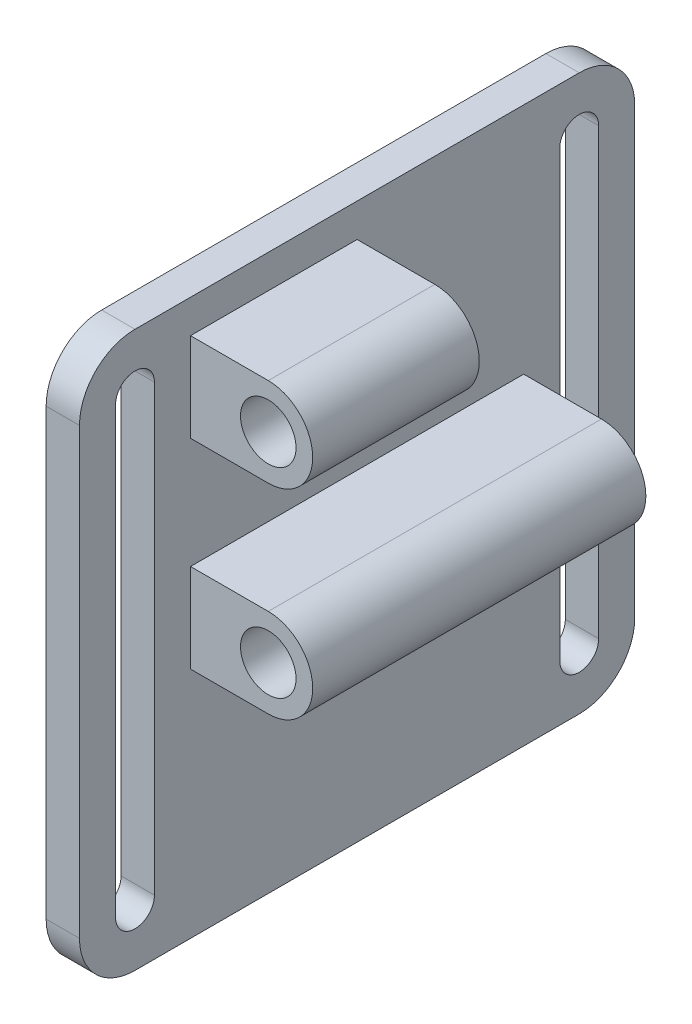
ISO-10303-21;
HEADER;
FILE_DESCRIPTION(('STEP AP214'),'2;1');
FILE_NAME('part.step','',(''),(''),'','','');
FILE_SCHEMA(('AUTOMOTIVE_DESIGN { 1 0 10303 214 1 1 1 1 }'));
ENDSEC;
DATA;
#1=APPLICATION_CONTEXT('core data for automotive mechanical design processes');
#2=APPLICATION_PROTOCOL_DEFINITION('international standard','automotive_design',2000,#1);
#3=PRODUCT_CONTEXT('',#1,'mechanical');
#4=PRODUCT('Part','Part','',(#3));
#5=PRODUCT_RELATED_PRODUCT_CATEGORY('part','',(#4));
#6=PRODUCT_DEFINITION_FORMATION('','',#4);
#7=PRODUCT_DEFINITION_CONTEXT('part definition',#1,'design');
#8=PRODUCT_DEFINITION('design','',#6,#7);
#9=PRODUCT_DEFINITION_SHAPE('','',#8);
#10=(LENGTH_UNIT() NAMED_UNIT(*) SI_UNIT(.MILLI.,.METRE.));
#11=(NAMED_UNIT(*) PLANE_ANGLE_UNIT() SI_UNIT($,.RADIAN.));
#12=(NAMED_UNIT(*) SI_UNIT($,.STERADIAN.) SOLID_ANGLE_UNIT());
#13=UNCERTAINTY_MEASURE_WITH_UNIT(LENGTH_MEASURE(1.E-05),#10,'distance_accuracy_value','');
#14=(GEOMETRIC_REPRESENTATION_CONTEXT(3) GLOBAL_UNCERTAINTY_ASSIGNED_CONTEXT((#13)) GLOBAL_UNIT_ASSIGNED_CONTEXT((#10,
#11,#12)) REPRESENTATION_CONTEXT('',''));
#15=CARTESIAN_POINT('',(0.,0.,0.));
#16=DIRECTION('',(0.,0.,1.));
#17=DIRECTION('',(1.,0.,0.));
#18=AXIS2_PLACEMENT_3D('',#15,#16,#17);
#19=CARTESIAN_POINT('',(3.,0.,0.));
#20=DIRECTION('',(1.,0.,0.));
#21=DIRECTION('',(0.,0.,-1.));
#22=AXIS2_PLACEMENT_3D('',#19,#20,#21);
#23=PLANE('',#22);
#24=DIRECTION('',(0.,-1.,0.));
#25=VECTOR('',#24,1.);
#26=CARTESIAN_POINT('',(3.,0.,15.));
#27=LINE('',#26,#25);
#28=CARTESIAN_POINT('',(3.,22.,15.));
#29=VERTEX_POINT('',#28);
#30=CARTESIAN_POINT('',(3.,14.,15.));
#31=VERTEX_POINT('',#30);
#32=EDGE_CURVE('E273',#29,#31,#27,.T.);
#33=ORIENTED_EDGE('',*,*,#32,.F.);
#34=DIRECTION('',(0.,0.,-1.));
#35=VECTOR('',#34,1.);
#36=CARTESIAN_POINT('',(3.,22.,0.));
#37=LINE('',#36,#35);
#38=CARTESIAN_POINT('',(3.,22.,0.));
#39=VERTEX_POINT('',#38);
#40=EDGE_CURVE('E275',#29,#39,#37,.T.);
#41=ORIENTED_EDGE('',*,*,#40,.T.);
#42=DIRECTION('',(0.,-1.,0.));
#43=VECTOR('',#42,1.);
#44=CARTESIAN_POINT('',(3.,0.,0.));
#45=LINE('',#44,#43);
#46=CARTESIAN_POINT('',(3.,14.,0.));
#47=VERTEX_POINT('',#46);
#48=EDGE_CURVE('E270',#39,#47,#45,.T.);
#49=ORIENTED_EDGE('',*,*,#48,.T.);
#50=DIRECTION('',(0.,0.,-1.));
#51=VECTOR('',#50,1.);
#52=CARTESIAN_POINT('',(3.,14.,0.));
#53=LINE('',#52,#51);
#54=EDGE_CURVE('E278',#31,#47,#53,.T.);
#55=ORIENTED_EDGE('',*,*,#54,.F.);
#56=EDGE_LOOP('',(#33,#41,#49,#55));
#57=FACE_BOUND('',#56,.T.);
#58=CARTESIAN_POINT('',(3.,20.,-20.));
#59=DIRECTION('',(1.,0.,0.));
#60=DIRECTION('',(0.,0.,-1.));
#61=AXIS2_PLACEMENT_3D('',#58,#59,#60);
#62=CIRCLE('',#61,1.75);
#63=CARTESIAN_POINT('',(3.,20.,-21.75));
#64=VERTEX_POINT('',#63);
#65=CARTESIAN_POINT('',(3.,20.,-18.25));
#66=VERTEX_POINT('',#65);
#67=EDGE_CURVE('E282',#64,#66,#62,.T.);
#68=ORIENTED_EDGE('',*,*,#67,.F.);
#69=DIRECTION('',(0.,1.,0.));
#70=VECTOR('',#69,1.);
#71=CARTESIAN_POINT('',(3.,0.,-21.75));
#72=LINE('',#71,#70);
#73=CARTESIAN_POINT('',(3.,-20.,-21.75));
#74=VERTEX_POINT('',#73);
#75=EDGE_CURVE('E285',#74,#64,#72,.T.);
#76=ORIENTED_EDGE('',*,*,#75,.F.);
#77=CARTESIAN_POINT('',(3.,-20.,-20.));
#78=DIRECTION('',(1.,0.,0.));
#79=DIRECTION('',(0.,0.,-1.));
#80=AXIS2_PLACEMENT_3D('',#77,#78,#79);
#81=CIRCLE('',#80,1.75);
#82=CARTESIAN_POINT('',(3.,-20.,-18.25));
#83=VERTEX_POINT('',#82);
#84=EDGE_CURVE('E289',#83,#74,#81,.T.);
#85=ORIENTED_EDGE('',*,*,#84,.F.);
#86=DIRECTION('',(0.,-1.,0.));
#87=VECTOR('',#86,1.);
#88=CARTESIAN_POINT('',(3.,0.,-18.25));
#89=LINE('',#88,#87);
#90=EDGE_CURVE('E292',#66,#83,#89,.T.);
#91=ORIENTED_EDGE('',*,*,#90,.F.);
#92=EDGE_LOOP('',(#68,#76,#85,#91));
#93=FACE_BOUND('',#92,.T.);
#94=CARTESIAN_POINT('',(3.,-20.,20.));
#95=DIRECTION('',(1.,0.,0.));
#96=DIRECTION('',(0.,0.,-1.));
#97=AXIS2_PLACEMENT_3D('',#94,#95,#96);
#98=CIRCLE('',#97,1.75);
#99=CARTESIAN_POINT('',(3.,-20.,21.75));
#100=VERTEX_POINT('',#99);
#101=CARTESIAN_POINT('',(3.,-20.,18.25));
#102=VERTEX_POINT('',#101);
#103=EDGE_CURVE('E295',#100,#102,#98,.T.);
#104=ORIENTED_EDGE('',*,*,#103,.F.);
#105=DIRECTION('',(0.,-1.,0.));
#106=VECTOR('',#105,1.);
#107=CARTESIAN_POINT('',(3.,0.,21.75));
#108=LINE('',#107,#106);
#109=CARTESIAN_POINT('',(3.,20.,21.75));
#110=VERTEX_POINT('',#109);
#111=EDGE_CURVE('E298',#110,#100,#108,.T.);
#112=ORIENTED_EDGE('',*,*,#111,.F.);
#113=CARTESIAN_POINT('',(3.,20.,20.));
#114=DIRECTION('',(1.,0.,0.));
#115=DIRECTION('',(0.,0.,-1.));
#116=AXIS2_PLACEMENT_3D('',#113,#114,#115);
#117=CIRCLE('',#116,1.75);
#118=CARTESIAN_POINT('',(3.,20.,18.25));
#119=VERTEX_POINT('',#118);
#120=EDGE_CURVE('E301',#119,#110,#117,.T.);
#121=ORIENTED_EDGE('',*,*,#120,.F.);
#122=DIRECTION('',(0.,1.,0.));
#123=VECTOR('',#122,1.);
#124=CARTESIAN_POINT('',(3.,0.,18.25));
#125=LINE('',#124,#123);
#126=EDGE_CURVE('E304',#102,#119,#125,.T.);
#127=ORIENTED_EDGE('',*,*,#126,.F.);
#128=EDGE_LOOP('',(#104,#112,#121,#127));
#129=FACE_BOUND('',#128,.T.);
#130=DIRECTION('',(0.,0.,-1.));
#131=VECTOR('',#130,1.);
#132=CARTESIAN_POINT('',(3.,-25.,0.));
#133=LINE('',#132,#131);
#134=CARTESIAN_POINT('',(3.,-25.,20.));
#135=VERTEX_POINT('',#134);
#136=CARTESIAN_POINT('',(3.,-25.,-20.));
#137=VERTEX_POINT('',#136);
#138=EDGE_CURVE('E316',#135,#137,#133,.T.);
#139=ORIENTED_EDGE('',*,*,#138,.T.);
#140=CARTESIAN_POINT('',(3.,-20.,-20.));
#141=DIRECTION('',(1.,0.,0.));
#142=DIRECTION('',(0.,0.,-1.));
#143=AXIS2_PLACEMENT_3D('',#140,#141,#142);
#144=CIRCLE('',#143,5.);
#145=CARTESIAN_POINT('',(3.,-20.,-25.));
#146=VERTEX_POINT('',#145);
#147=EDGE_CURVE('E393',#137,#146,#144,.T.);
#148=ORIENTED_EDGE('',*,*,#147,.T.);
#149=DIRECTION('',(0.,-1.,0.));
#150=VECTOR('',#149,1.);
#151=CARTESIAN_POINT('',(3.,0.,-25.));
#152=LINE('',#151,#150);
#153=CARTESIAN_POINT('',(3.,20.,-25.));
#154=VERTEX_POINT('',#153);
#155=EDGE_CURVE('E307',#154,#146,#152,.T.);
#156=ORIENTED_EDGE('',*,*,#155,.F.);
#157=CARTESIAN_POINT('',(3.,20.,-20.));
#158=DIRECTION('',(1.,0.,0.));
#159=DIRECTION('',(0.,0.,-1.));
#160=AXIS2_PLACEMENT_3D('',#157,#158,#159);
#161=CIRCLE('',#160,5.);
#162=CARTESIAN_POINT('',(3.,25.,-20.));
#163=VERTEX_POINT('',#162);
#164=EDGE_CURVE('E387',#154,#163,#161,.T.);
#165=ORIENTED_EDGE('',*,*,#164,.T.);
#166=DIRECTION('',(0.,0.,-1.));
#167=VECTOR('',#166,1.);
#168=CARTESIAN_POINT('',(3.,25.,0.));
#169=LINE('',#168,#167);
#170=CARTESIAN_POINT('',(3.,25.,20.));
#171=VERTEX_POINT('',#170);
#172=EDGE_CURVE('E310',#171,#163,#169,.T.);
#173=ORIENTED_EDGE('',*,*,#172,.F.);
#174=CARTESIAN_POINT('',(3.,20.,20.));
#175=DIRECTION('',(1.,0.,0.));
#176=DIRECTION('',(0.,0.,-1.));
#177=AXIS2_PLACEMENT_3D('',#174,#175,#176);
#178=CIRCLE('',#177,5.);
#179=CARTESIAN_POINT('',(3.,20.,25.));
#180=VERTEX_POINT('',#179);
#181=EDGE_CURVE('E389',#171,#180,#178,.T.);
#182=ORIENTED_EDGE('',*,*,#181,.T.);
#183=DIRECTION('',(0.,-1.,0.));
#184=VECTOR('',#183,1.);
#185=CARTESIAN_POINT('',(3.,0.,25.));
#186=LINE('',#185,#184);
#187=CARTESIAN_POINT('',(3.,-20.,25.));
#188=VERTEX_POINT('',#187);
#189=EDGE_CURVE('E313',#180,#188,#186,.T.);
#190=ORIENTED_EDGE('',*,*,#189,.T.);
#191=CARTESIAN_POINT('',(3.,-20.,20.));
#192=DIRECTION('',(1.,0.,0.));
#193=DIRECTION('',(0.,0.,-1.));
#194=AXIS2_PLACEMENT_3D('',#191,#192,#193);
#195=CIRCLE('',#194,5.);
#196=EDGE_CURVE('E391',#188,#135,#195,.T.);
#197=ORIENTED_EDGE('',*,*,#196,.T.);
#198=EDGE_LOOP('',(#139,#148,#156,#165,#173,#182,#190,#197));
#199=FACE_BOUND('',#198,.T.);
#200=DIRECTION('',(0.,0.,-1.));
#201=VECTOR('',#200,1.);
#202=CARTESIAN_POINT('',(3.,4.,0.));
#203=LINE('',#202,#201);
#204=CARTESIAN_POINT('',(3.,4.,15.));
#205=VERTEX_POINT('',#204);
#206=CARTESIAN_POINT('',(3.,4.,-15.));
#207=VERTEX_POINT('',#206);
#208=EDGE_CURVE('E61',#205,#207,#203,.T.);
#209=ORIENTED_EDGE('',*,*,#208,.T.);
#210=DIRECTION('',(0.,-1.,0.));
#211=VECTOR('',#210,1.);
#212=CARTESIAN_POINT('',(3.,0.,-15.));
#213=LINE('',#212,#211);
#214=CARTESIAN_POINT('',(3.,-4.,-15.));
#215=VERTEX_POINT('',#214);
#216=EDGE_CURVE('E56',#207,#215,#213,.T.);
#217=ORIENTED_EDGE('',*,*,#216,.T.);
#218=DIRECTION('',(0.,0.,1.));
#219=VECTOR('',#218,1.);
#220=CARTESIAN_POINT('',(3.,-4.,0.));
#221=LINE('',#220,#219);
#222=CARTESIAN_POINT('',(3.,-4.,15.));
#223=VERTEX_POINT('',#222);
#224=EDGE_CURVE('E242',#215,#223,#221,.T.);
#225=ORIENTED_EDGE('',*,*,#224,.T.);
#226=DIRECTION('',(0.,-1.,0.));
#227=VECTOR('',#226,1.);
#228=CARTESIAN_POINT('',(3.,0.,15.));
#229=LINE('',#228,#227);
#230=EDGE_CURVE('E224',#205,#223,#229,.T.);
#231=ORIENTED_EDGE('',*,*,#230,.F.);
#232=EDGE_LOOP('',(#209,#217,#225,#231));
#233=FACE_BOUND('',#232,.T.);
#234=ADVANCED_FACE('F41',(#57,#93,#129,#199,#233),#23,.T.);
#235=CARTESIAN_POINT('',(3.,0.,-25.));
#236=DIRECTION('',(0.,0.,-1.));
#237=DIRECTION('',(0.,1.,0.));
#238=AXIS2_PLACEMENT_3D('',#235,#236,#237);
#239=PLANE('',#238);
#240=ORIENTED_EDGE('',*,*,#155,.T.);
#241=DIRECTION('',(-1.,0.,0.));
#242=VECTOR('',#241,1.);
#243=CARTESIAN_POINT('',(0.,-20.,-25.));
#244=LINE('',#243,#242);
#245=CARTESIAN_POINT('',(0.,-20.,-25.));
#246=VERTEX_POINT('',#245);
#247=EDGE_CURVE('E371',#146,#246,#244,.T.);
#248=ORIENTED_EDGE('',*,*,#247,.T.);
#249=DIRECTION('',(0.,-1.,0.));
#250=VECTOR('',#249,1.);
#251=CARTESIAN_POINT('',(0.,0.,-25.));
#252=LINE('',#251,#250);
#253=CARTESIAN_POINT('',(0.,20.,-25.));
#254=VERTEX_POINT('',#253);
#255=EDGE_CURVE('E343',#254,#246,#252,.T.);
#256=ORIENTED_EDGE('',*,*,#255,.F.);
#257=DIRECTION('',(-1.,0.,0.));
#258=VECTOR('',#257,1.);
#259=CARTESIAN_POINT('',(3.,20.,-25.));
#260=LINE('',#259,#258);
#261=EDGE_CURVE('E363',#254,#154,#260,.F.);
#262=ORIENTED_EDGE('',*,*,#261,.T.);
#263=EDGE_LOOP('',(#240,#248,#256,#262));
#264=FACE_BOUND('',#263,.T.);
#265=ADVANCED_FACE('F436',(#264),#239,.T.);
#266=CARTESIAN_POINT('',(3.,25.,0.));
#267=DIRECTION('',(0.,1.,0.));
#268=DIRECTION('',(0.,0.,1.));
#269=AXIS2_PLACEMENT_3D('',#266,#267,#268);
#270=PLANE('',#269);
#271=DIRECTION('',(0.,0.,-1.));
#272=VECTOR('',#271,1.);
#273=CARTESIAN_POINT('',(0.,25.,0.));
#274=LINE('',#273,#272);
#275=CARTESIAN_POINT('',(0.,25.,20.));
#276=VERTEX_POINT('',#275);
#277=CARTESIAN_POINT('',(0.,25.,-20.));
#278=VERTEX_POINT('',#277);
#279=EDGE_CURVE('E346',#276,#278,#274,.T.);
#280=ORIENTED_EDGE('',*,*,#279,.F.);
#281=DIRECTION('',(-1.,0.,0.));
#282=VECTOR('',#281,1.);
#283=CARTESIAN_POINT('',(3.,25.,20.));
#284=LINE('',#283,#282);
#285=EDGE_CURVE('E11',#276,#171,#284,.F.);
#286=ORIENTED_EDGE('',*,*,#285,.T.);
#287=ORIENTED_EDGE('',*,*,#172,.T.);
#288=DIRECTION('',(-1.,0.,0.));
#289=VECTOR('',#288,1.);
#290=CARTESIAN_POINT('',(3.,25.,-20.));
#291=LINE('',#290,#289);
#292=EDGE_CURVE('E49',#163,#278,#291,.T.);
#293=ORIENTED_EDGE('',*,*,#292,.T.);
#294=EDGE_LOOP('',(#280,#286,#287,#293));
#295=FACE_BOUND('',#294,.T.);
#296=ADVANCED_FACE('F403',(#295),#270,.T.);
#297=CARTESIAN_POINT('',(3.,0.,25.));
#298=DIRECTION('',(0.,0.,-1.));
#299=DIRECTION('',(0.,1.,0.));
#300=AXIS2_PLACEMENT_3D('',#297,#298,#299);
#301=PLANE('',#300);
#302=DIRECTION('',(0.,-1.,0.));
#303=VECTOR('',#302,1.);
#304=CARTESIAN_POINT('',(0.,0.,25.));
#305=LINE('',#304,#303);
#306=CARTESIAN_POINT('',(0.,20.,25.));
#307=VERTEX_POINT('',#306);
#308=CARTESIAN_POINT('',(0.,-20.,25.));
#309=VERTEX_POINT('',#308);
#310=EDGE_CURVE('E349',#307,#309,#305,.T.);
#311=ORIENTED_EDGE('',*,*,#310,.T.);
#312=DIRECTION('',(-1.,0.,0.));
#313=VECTOR('',#312,1.);
#314=CARTESIAN_POINT('',(3.,-20.,25.));
#315=LINE('',#314,#313);
#316=EDGE_CURVE('E398',#309,#188,#315,.F.);
#317=ORIENTED_EDGE('',*,*,#316,.T.);
#318=ORIENTED_EDGE('',*,*,#189,.F.);
#319=DIRECTION('',(-1.,0.,0.));
#320=VECTOR('',#319,1.);
#321=CARTESIAN_POINT('',(0.,20.,25.));
#322=LINE('',#321,#320);
#323=EDGE_CURVE('E395',#180,#307,#322,.T.);
#324=ORIENTED_EDGE('',*,*,#323,.T.);
#325=EDGE_LOOP('',(#311,#317,#318,#324));
#326=FACE_BOUND('',#325,.T.);
#327=ADVANCED_FACE('F419',(#326),#301,.F.);
#328=CARTESIAN_POINT('',(3.,-20.,20.));
#329=DIRECTION('',(-1.,0.,0.));
#330=DIRECTION('',(0.,0.,1.));
#331=AXIS2_PLACEMENT_3D('',#328,#329,#330);
#332=CYLINDRICAL_SURFACE('',#331,1.75);
#333=CARTESIAN_POINT('',(0.,-20.,20.));
#334=DIRECTION('',(1.,0.,0.));
#335=DIRECTION('',(0.,0.,-1.));
#336=AXIS2_PLACEMENT_3D('',#333,#334,#335);
#337=CIRCLE('',#336,1.75);
#338=CARTESIAN_POINT('',(0.,-20.,21.75));
#339=VERTEX_POINT('',#338);
#340=CARTESIAN_POINT('',(0.,-20.,18.25));
#341=VERTEX_POINT('',#340);
#342=EDGE_CURVE('E331',#339,#341,#337,.T.);
#343=ORIENTED_EDGE('',*,*,#342,.F.);
#344=DIRECTION('',(-1.,0.,0.));
#345=VECTOR('',#344,1.);
#346=CARTESIAN_POINT('',(3.,-20.,21.75));
#347=LINE('',#346,#345);
#348=EDGE_CURVE('E361',#100,#339,#347,.T.);
#349=ORIENTED_EDGE('',*,*,#348,.F.);
#350=ORIENTED_EDGE('',*,*,#103,.T.);
#351=DIRECTION('',(-1.,0.,0.));
#352=VECTOR('',#351,1.);
#353=CARTESIAN_POINT('',(3.,-20.,18.25));
#354=LINE('',#353,#352);
#355=EDGE_CURVE('E354',#102,#341,#354,.T.);
#356=ORIENTED_EDGE('',*,*,#355,.T.);
#357=EDGE_LOOP('',(#343,#349,#350,#356));
#358=FACE_BOUND('',#357,.T.);
#359=ADVANCED_FACE('F466',(#358),#332,.F.);
#360=CARTESIAN_POINT('',(3.,0.,21.75));
#361=DIRECTION('',(0.,0.,-1.));
#362=DIRECTION('',(0.,1.,0.));
#363=AXIS2_PLACEMENT_3D('',#360,#361,#362);
#364=PLANE('',#363);
#365=DIRECTION('',(0.,-1.,0.));
#366=VECTOR('',#365,1.);
#367=CARTESIAN_POINT('',(0.,0.,21.75));
#368=LINE('',#367,#366);
#369=CARTESIAN_POINT('',(0.,20.,21.75));
#370=VERTEX_POINT('',#369);
#371=EDGE_CURVE('E334',#370,#339,#368,.T.);
#372=ORIENTED_EDGE('',*,*,#371,.F.);
#373=DIRECTION('',(-1.,0.,0.));
#374=VECTOR('',#373,1.);
#375=CARTESIAN_POINT('',(3.,20.,21.75));
#376=LINE('',#375,#374);
#377=EDGE_CURVE('E359',#110,#370,#376,.T.);
#378=ORIENTED_EDGE('',*,*,#377,.F.);
#379=ORIENTED_EDGE('',*,*,#111,.T.);
#380=ORIENTED_EDGE('',*,*,#348,.T.);
#381=EDGE_LOOP('',(#372,#378,#379,#380));
#382=FACE_BOUND('',#381,.T.);
#383=ADVANCED_FACE('F478',(#382),#364,.T.);
#384=CARTESIAN_POINT('',(3.,20.,20.));
#385=DIRECTION('',(-1.,0.,0.));
#386=DIRECTION('',(0.,0.,1.));
#387=AXIS2_PLACEMENT_3D('',#384,#385,#386);
#388=CYLINDRICAL_SURFACE('',#387,1.75);
#389=CARTESIAN_POINT('',(0.,20.,20.));
#390=DIRECTION('',(1.,0.,0.));
#391=DIRECTION('',(0.,0.,-1.));
#392=AXIS2_PLACEMENT_3D('',#389,#390,#391);
#393=CIRCLE('',#392,1.75);
#394=CARTESIAN_POINT('',(0.,20.,18.25));
#395=VERTEX_POINT('',#394);
#396=EDGE_CURVE('E337',#395,#370,#393,.T.);
#397=ORIENTED_EDGE('',*,*,#396,.F.);
#398=DIRECTION('',(-1.,0.,0.));
#399=VECTOR('',#398,1.);
#400=CARTESIAN_POINT('',(3.,20.,18.25));
#401=LINE('',#400,#399);
#402=EDGE_CURVE('E356',#119,#395,#401,.T.);
#403=ORIENTED_EDGE('',*,*,#402,.F.);
#404=ORIENTED_EDGE('',*,*,#120,.T.);
#405=ORIENTED_EDGE('',*,*,#377,.T.);
#406=EDGE_LOOP('',(#397,#403,#404,#405));
#407=FACE_BOUND('',#406,.T.);
#408=ADVANCED_FACE('F474',(#407),#388,.F.);
#409=CARTESIAN_POINT('',(3.,20.,-20.));
#410=DIRECTION('',(-1.,0.,0.));
#411=DIRECTION('',(0.,0.,1.));
#412=AXIS2_PLACEMENT_3D('',#409,#410,#411);
#413=CYLINDRICAL_SURFACE('',#412,1.75);
#414=CARTESIAN_POINT('',(0.,20.,-20.));
#415=DIRECTION('',(1.,0.,0.));
#416=DIRECTION('',(0.,0.,-1.));
#417=AXIS2_PLACEMENT_3D('',#414,#415,#416);
#418=CIRCLE('',#417,1.75);
#419=CARTESIAN_POINT('',(0.,20.,-21.75));
#420=VERTEX_POINT('',#419);
#421=CARTESIAN_POINT('',(0.,20.,-18.25));
#422=VERTEX_POINT('',#421);
#423=EDGE_CURVE('E281',#420,#422,#418,.T.);
#424=ORIENTED_EDGE('',*,*,#423,.F.);
#425=DIRECTION('',(-1.,0.,0.));
#426=VECTOR('',#425,1.);
#427=CARTESIAN_POINT('',(3.,20.,-21.75));
#428=LINE('',#427,#426);
#429=EDGE_CURVE('E357',#64,#420,#428,.T.);
#430=ORIENTED_EDGE('',*,*,#429,.F.);
#431=ORIENTED_EDGE('',*,*,#67,.T.);
#432=DIRECTION('',(-1.,0.,0.));
#433=VECTOR('',#432,1.);
#434=CARTESIAN_POINT('',(3.,20.,-18.25));
#435=LINE('',#434,#433);
#436=EDGE_CURVE('E319',#66,#422,#435,.T.);
#437=ORIENTED_EDGE('',*,*,#436,.T.);
#438=EDGE_LOOP('',(#424,#430,#431,#437));
#439=FACE_BOUND('',#438,.T.);
#440=ADVANCED_FACE('F477',(#439),#413,.F.);
#441=CARTESIAN_POINT('',(3.,0.,-21.75));
#442=DIRECTION('',(0.,0.,1.));
#443=DIRECTION('',(1.,0.,0.));
#444=AXIS2_PLACEMENT_3D('',#441,#442,#443);
#445=PLANE('',#444);
#446=DIRECTION('',(0.,1.,0.));
#447=VECTOR('',#446,1.);
#448=CARTESIAN_POINT('',(0.,0.,-21.75));
#449=LINE('',#448,#447);
#450=CARTESIAN_POINT('',(0.,-20.,-21.75));
#451=VERTEX_POINT('',#450);
#452=EDGE_CURVE('E322',#451,#420,#449,.T.);
#453=ORIENTED_EDGE('',*,*,#452,.F.);
#454=DIRECTION('',(-1.,0.,0.));
#455=VECTOR('',#454,1.);
#456=CARTESIAN_POINT('',(3.,-20.,-21.75));
#457=LINE('',#456,#455);
#458=EDGE_CURVE('E367',#74,#451,#457,.T.);
#459=ORIENTED_EDGE('',*,*,#458,.F.);
#460=ORIENTED_EDGE('',*,*,#75,.T.);
#461=ORIENTED_EDGE('',*,*,#429,.T.);
#462=EDGE_LOOP('',(#453,#459,#460,#461));
#463=FACE_BOUND('',#462,.T.);
#464=ADVANCED_FACE('F491',(#463),#445,.T.);
#465=CARTESIAN_POINT('',(3.,-20.,-20.));
#466=DIRECTION('',(-1.,0.,0.));
#467=DIRECTION('',(0.,0.,1.));
#468=AXIS2_PLACEMENT_3D('',#465,#466,#467);
#469=CYLINDRICAL_SURFACE('',#468,1.75);
#470=CARTESIAN_POINT('',(0.,-20.,-20.));
#471=DIRECTION('',(1.,0.,0.));
#472=DIRECTION('',(0.,0.,-1.));
#473=AXIS2_PLACEMENT_3D('',#470,#471,#472);
#474=CIRCLE('',#473,1.75);
#475=CARTESIAN_POINT('',(0.,-20.,-18.25));
#476=VERTEX_POINT('',#475);
#477=EDGE_CURVE('E325',#476,#451,#474,.T.);
#478=ORIENTED_EDGE('',*,*,#477,.F.);
#479=DIRECTION('',(-1.,0.,0.));
#480=VECTOR('',#479,1.);
#481=CARTESIAN_POINT('',(3.,-20.,-18.25));
#482=LINE('',#481,#480);
#483=EDGE_CURVE('E365',#83,#476,#482,.T.);
#484=ORIENTED_EDGE('',*,*,#483,.F.);
#485=ORIENTED_EDGE('',*,*,#84,.T.);
#486=ORIENTED_EDGE('',*,*,#458,.T.);
#487=EDGE_LOOP('',(#478,#484,#485,#486));
#488=FACE_BOUND('',#487,.T.);
#489=ADVANCED_FACE('F472',(#488),#469,.F.);
#490=CARTESIAN_POINT('',(3.,0.,18.25));
#491=DIRECTION('',(0.,0.,1.));
#492=DIRECTION('',(0.,-1.,0.));
#493=AXIS2_PLACEMENT_3D('',#490,#491,#492);
#494=PLANE('',#493);
#495=DIRECTION('',(0.,1.,0.));
#496=VECTOR('',#495,1.);
#497=CARTESIAN_POINT('',(0.,0.,18.25));
#498=LINE('',#497,#496);
#499=EDGE_CURVE('E340',#341,#395,#498,.T.);
#500=ORIENTED_EDGE('',*,*,#499,.F.);
#501=ORIENTED_EDGE('',*,*,#355,.F.);
#502=ORIENTED_EDGE('',*,*,#126,.T.);
#503=ORIENTED_EDGE('',*,*,#402,.T.);
#504=EDGE_LOOP('',(#500,#501,#502,#503));
#505=FACE_BOUND('',#504,.T.);
#506=ADVANCED_FACE('F469',(#505),#494,.T.);
#507=CARTESIAN_POINT('',(3.,0.,-18.25));
#508=DIRECTION('',(0.,0.,-1.));
#509=DIRECTION('',(-1.,0.,0.));
#510=AXIS2_PLACEMENT_3D('',#507,#508,#509);
#511=PLANE('',#510);
#512=DIRECTION('',(0.,-1.,0.));
#513=VECTOR('',#512,1.);
#514=CARTESIAN_POINT('',(0.,0.,-18.25));
#515=LINE('',#514,#513);
#516=EDGE_CURVE('E328',#422,#476,#515,.T.);
#517=ORIENTED_EDGE('',*,*,#516,.F.);
#518=ORIENTED_EDGE('',*,*,#436,.F.);
#519=ORIENTED_EDGE('',*,*,#90,.T.);
#520=ORIENTED_EDGE('',*,*,#483,.T.);
#521=EDGE_LOOP('',(#517,#518,#519,#520));
#522=FACE_BOUND('',#521,.T.);
#523=ADVANCED_FACE('F463',(#522),#511,.T.);
#524=CARTESIAN_POINT('',(3.,-25.,0.));
#525=DIRECTION('',(0.,1.,0.));
#526=DIRECTION('',(0.,0.,1.));
#527=AXIS2_PLACEMENT_3D('',#524,#525,#526);
#528=PLANE('',#527);
#529=DIRECTION('',(0.,0.,-1.));
#530=VECTOR('',#529,1.);
#531=CARTESIAN_POINT('',(0.,-25.,0.));
#532=LINE('',#531,#530);
#533=CARTESIAN_POINT('',(0.,-25.,20.));
#534=VERTEX_POINT('',#533);
#535=CARTESIAN_POINT('',(0.,-25.,-20.));
#536=VERTEX_POINT('',#535);
#537=EDGE_CURVE('E286',#534,#536,#532,.T.);
#538=ORIENTED_EDGE('',*,*,#537,.T.);
#539=DIRECTION('',(-1.,0.,0.));
#540=VECTOR('',#539,1.);
#541=CARTESIAN_POINT('',(3.,-25.,-20.));
#542=LINE('',#541,#540);
#543=EDGE_CURVE('E385',#536,#137,#542,.F.);
#544=ORIENTED_EDGE('',*,*,#543,.T.);
#545=ORIENTED_EDGE('',*,*,#138,.F.);
#546=DIRECTION('',(-1.,0.,0.));
#547=VECTOR('',#546,1.);
#548=CARTESIAN_POINT('',(3.,-25.,20.));
#549=LINE('',#548,#547);
#550=EDGE_CURVE('E382',#135,#534,#549,.T.);
#551=ORIENTED_EDGE('',*,*,#550,.T.);
#552=EDGE_LOOP('',(#538,#544,#545,#551));
#553=FACE_BOUND('',#552,.T.);
#554=ADVANCED_FACE('F429',(#553),#528,.F.);
#555=CARTESIAN_POINT('',(0.,0.,0.));
#556=DIRECTION('',(1.,0.,0.));
#557=DIRECTION('',(0.,0.,-1.));
#558=AXIS2_PLACEMENT_3D('',#555,#556,#557);
#559=PLANE('',#558);
#560=ORIENTED_EDGE('',*,*,#255,.T.);
#561=CARTESIAN_POINT('',(0.,-20.,-20.));
#562=DIRECTION('',(1.,0.,0.));
#563=DIRECTION('',(0.,0.,-1.));
#564=AXIS2_PLACEMENT_3D('',#561,#562,#563);
#565=CIRCLE('',#564,5.);
#566=EDGE_CURVE('E380',#246,#536,#565,.F.);
#567=ORIENTED_EDGE('',*,*,#566,.T.);
#568=ORIENTED_EDGE('',*,*,#537,.F.);
#569=CARTESIAN_POINT('',(0.,-20.,20.));
#570=DIRECTION('',(1.,0.,0.));
#571=DIRECTION('',(0.,0.,-1.));
#572=AXIS2_PLACEMENT_3D('',#569,#570,#571);
#573=CIRCLE('',#572,5.);
#574=EDGE_CURVE('E378',#534,#309,#573,.F.);
#575=ORIENTED_EDGE('',*,*,#574,.T.);
#576=ORIENTED_EDGE('',*,*,#310,.F.);
#577=CARTESIAN_POINT('',(0.,20.,20.));
#578=DIRECTION('',(1.,0.,0.));
#579=DIRECTION('',(0.,0.,-1.));
#580=AXIS2_PLACEMENT_3D('',#577,#578,#579);
#581=CIRCLE('',#580,5.);
#582=EDGE_CURVE('E376',#307,#276,#581,.F.);
#583=ORIENTED_EDGE('',*,*,#582,.T.);
#584=ORIENTED_EDGE('',*,*,#279,.T.);
#585=CARTESIAN_POINT('',(0.,20.,-20.));
#586=DIRECTION('',(1.,0.,0.));
#587=DIRECTION('',(0.,0.,-1.));
#588=AXIS2_PLACEMENT_3D('',#585,#586,#587);
#589=CIRCLE('',#588,5.);
#590=EDGE_CURVE('E374',#278,#254,#589,.F.);
#591=ORIENTED_EDGE('',*,*,#590,.T.);
#592=EDGE_LOOP('',(#560,#567,#568,#575,#576,#583,#584,#591));
#593=FACE_BOUND('',#592,.T.);
#594=ORIENTED_EDGE('',*,*,#342,.T.);
#595=ORIENTED_EDGE('',*,*,#499,.T.);
#596=ORIENTED_EDGE('',*,*,#396,.T.);
#597=ORIENTED_EDGE('',*,*,#371,.T.);
#598=EDGE_LOOP('',(#594,#595,#596,#597));
#599=FACE_BOUND('',#598,.T.);
#600=ORIENTED_EDGE('',*,*,#423,.T.);
#601=ORIENTED_EDGE('',*,*,#516,.T.);
#602=ORIENTED_EDGE('',*,*,#477,.T.);
#603=ORIENTED_EDGE('',*,*,#452,.T.);
#604=EDGE_LOOP('',(#600,#601,#602,#603));
#605=FACE_BOUND('',#604,.T.);
#606=ADVANCED_FACE('F409',(#593,#599,#605),#559,.F.);
#607=CARTESIAN_POINT('',(0.,14.,15.));
#608=DIRECTION('',(0.,-1.,0.));
#609=DIRECTION('',(0.,0.,-1.));
#610=AXIS2_PLACEMENT_3D('',#607,#608,#609);
#611=PLANE('',#610);
#612=DIRECTION('',(-1.,0.,0.));
#613=VECTOR('',#612,1.);
#614=CARTESIAN_POINT('',(0.,14.,15.));
#615=LINE('',#614,#613);
#616=CARTESIAN_POINT('',(10.,14.,15.));
#617=VERTEX_POINT('',#616);
#618=EDGE_CURVE('E245',#617,#31,#615,.T.);
#619=ORIENTED_EDGE('',*,*,#618,.T.);
#620=ORIENTED_EDGE('',*,*,#54,.T.);
#621=DIRECTION('',(-1.,0.,0.));
#622=VECTOR('',#621,1.);
#623=CARTESIAN_POINT('',(0.,14.,0.));
#624=LINE('',#623,#622);
#625=CARTESIAN_POINT('',(10.,14.,0.));
#626=VERTEX_POINT('',#625);
#627=EDGE_CURVE('E244',#626,#47,#624,.T.);
#628=ORIENTED_EDGE('',*,*,#627,.F.);
#629=DIRECTION('',(0.,0.,-1.));
#630=VECTOR('',#629,1.);
#631=CARTESIAN_POINT('',(10.,14.,15.));
#632=LINE('',#631,#630);
#633=EDGE_CURVE('E268',#617,#626,#632,.T.);
#634=ORIENTED_EDGE('',*,*,#633,.F.);
#635=EDGE_LOOP('',(#619,#620,#628,#634));
#636=FACE_BOUND('',#635,.T.);
#637=ADVANCED_FACE('F457',(#636),#611,.T.);
#638=CARTESIAN_POINT('',(10.,18.,15.));
#639=DIRECTION('',(0.,0.,-1.));
#640=DIRECTION('',(-1.,0.,0.));
#641=AXIS2_PLACEMENT_3D('',#638,#639,#640);
#642=CYLINDRICAL_SURFACE('',#641,4.);
#643=CARTESIAN_POINT('',(10.,18.,0.));
#644=DIRECTION('',(0.,0.,1.));
#645=DIRECTION('',(1.,0.,0.));
#646=AXIS2_PLACEMENT_3D('',#643,#644,#645);
#647=CIRCLE('',#646,4.);
#648=CARTESIAN_POINT('',(10.,22.,0.));
#649=VERTEX_POINT('',#648);
#650=EDGE_CURVE('E259',#626,#649,#647,.T.);
#651=ORIENTED_EDGE('',*,*,#650,.T.);
#652=DIRECTION('',(0.,0.,-1.));
#653=VECTOR('',#652,1.);
#654=CARTESIAN_POINT('',(10.,22.,15.));
#655=LINE('',#654,#653);
#656=CARTESIAN_POINT('',(10.,22.,15.));
#657=VERTEX_POINT('',#656);
#658=EDGE_CURVE('E257',#657,#649,#655,.T.);
#659=ORIENTED_EDGE('',*,*,#658,.F.);
#660=CARTESIAN_POINT('',(10.,18.,15.));
#661=DIRECTION('',(0.,0.,1.));
#662=DIRECTION('',(1.,0.,0.));
#663=AXIS2_PLACEMENT_3D('',#660,#661,#662);
#664=CIRCLE('',#663,4.);
#665=EDGE_CURVE('E248',#617,#657,#664,.T.);
#666=ORIENTED_EDGE('',*,*,#665,.F.);
#667=ORIENTED_EDGE('',*,*,#633,.T.);
#668=EDGE_LOOP('',(#651,#659,#666,#667));
#669=FACE_BOUND('',#668,.T.);
#670=ADVANCED_FACE('F698',(#669),#642,.T.);
#671=CARTESIAN_POINT('',(0.,22.,15.));
#672=DIRECTION('',(0.,-1.,0.));
#673=DIRECTION('',(0.,0.,-1.));
#674=AXIS2_PLACEMENT_3D('',#671,#672,#673);
#675=PLANE('',#674);
#676=ORIENTED_EDGE('',*,*,#40,.F.);
#677=DIRECTION('',(-1.,0.,0.));
#678=VECTOR('',#677,1.);
#679=CARTESIAN_POINT('',(0.,22.,15.));
#680=LINE('',#679,#678);
#681=EDGE_CURVE('E251',#657,#29,#680,.T.);
#682=ORIENTED_EDGE('',*,*,#681,.F.);
#683=ORIENTED_EDGE('',*,*,#658,.T.);
#684=DIRECTION('',(-1.,0.,0.));
#685=VECTOR('',#684,1.);
#686=CARTESIAN_POINT('',(0.,22.,0.));
#687=LINE('',#686,#685);
#688=EDGE_CURVE('E261',#649,#39,#687,.T.);
#689=ORIENTED_EDGE('',*,*,#688,.T.);
#690=EDGE_LOOP('',(#676,#682,#683,#689));
#691=FACE_BOUND('',#690,.T.);
#692=ADVANCED_FACE('F707',(#691),#675,.F.);
#693=CARTESIAN_POINT('',(10.,18.,15.));
#694=DIRECTION('',(0.,0.,-1.));
#695=DIRECTION('',(-1.,0.,0.));
#696=AXIS2_PLACEMENT_3D('',#693,#694,#695);
#697=CYLINDRICAL_SURFACE('',#696,2.5);
#698=CARTESIAN_POINT('',(10.,18.,15.));
#699=DIRECTION('',(0.,0.,1.));
#700=DIRECTION('',(1.,0.,0.));
#701=AXIS2_PLACEMENT_3D('',#698,#699,#700);
#702=CIRCLE('',#701,2.5);
#703=CARTESIAN_POINT('',(12.5,18.,15.));
#704=VERTEX_POINT('',#703);
#705=EDGE_CURVE('E254',#704,#704,#702,.T.);
#706=ORIENTED_EDGE('',*,*,#705,.T.);
#707=EDGE_LOOP('',(#706));
#708=FACE_BOUND('',#707,.T.);
#709=CARTESIAN_POINT('',(10.,18.,0.));
#710=DIRECTION('',(0.,0.,1.));
#711=DIRECTION('',(1.,0.,0.));
#712=AXIS2_PLACEMENT_3D('',#709,#710,#711);
#713=CIRCLE('',#712,2.5);
#714=CARTESIAN_POINT('',(12.5,18.,0.));
#715=VERTEX_POINT('',#714);
#716=EDGE_CURVE('E249',#715,#715,#713,.T.);
#717=ORIENTED_EDGE('',*,*,#716,.F.);
#718=EDGE_LOOP('',(#717));
#719=FACE_BOUND('',#718,.T.);
#720=ADVANCED_FACE('F716',(#708,#719),#697,.F.);
#721=CARTESIAN_POINT('',(0.,0.,15.));
#722=DIRECTION('',(0.,0.,1.));
#723=DIRECTION('',(1.,0.,0.));
#724=AXIS2_PLACEMENT_3D('',#721,#722,#723);
#725=PLANE('',#724);
#726=ORIENTED_EDGE('',*,*,#681,.T.);
#727=ORIENTED_EDGE('',*,*,#32,.T.);
#728=ORIENTED_EDGE('',*,*,#618,.F.);
#729=ORIENTED_EDGE('',*,*,#665,.T.);
#730=EDGE_LOOP('',(#726,#727,#728,#729));
#731=FACE_BOUND('',#730,.T.);
#732=ORIENTED_EDGE('',*,*,#705,.F.);
#733=EDGE_LOOP('',(#732));
#734=FACE_BOUND('',#733,.T.);
#735=ADVANCED_FACE('F636',(#731,#734),#725,.T.);
#736=CARTESIAN_POINT('',(0.,0.,0.));
#737=DIRECTION('',(0.,0.,1.));
#738=DIRECTION('',(1.,0.,0.));
#739=AXIS2_PLACEMENT_3D('',#736,#737,#738);
#740=PLANE('',#739);
#741=ORIENTED_EDGE('',*,*,#48,.F.);
#742=ORIENTED_EDGE('',*,*,#688,.F.);
#743=ORIENTED_EDGE('',*,*,#650,.F.);
#744=ORIENTED_EDGE('',*,*,#627,.T.);
#745=EDGE_LOOP('',(#741,#742,#743,#744));
#746=FACE_BOUND('',#745,.T.);
#747=ORIENTED_EDGE('',*,*,#716,.T.);
#748=EDGE_LOOP('',(#747));
#749=FACE_BOUND('',#748,.T.);
#750=ADVANCED_FACE('F501',(#746,#749),#740,.F.);
#751=CARTESIAN_POINT('',(3.,-20.,-20.));
#752=DIRECTION('',(1.,0.,0.));
#753=DIRECTION('',(0.,0.,-1.));
#754=AXIS2_PLACEMENT_3D('',#751,#752,#753);
#755=CYLINDRICAL_SURFACE('',#754,5.);
#756=ORIENTED_EDGE('',*,*,#147,.F.);
#757=ORIENTED_EDGE('',*,*,#543,.F.);
#758=ORIENTED_EDGE('',*,*,#566,.F.);
#759=ORIENTED_EDGE('',*,*,#247,.F.);
#760=EDGE_LOOP('',(#756,#757,#758,#759));
#761=FACE_BOUND('',#760,.T.);
#762=ADVANCED_FACE('F434',(#761),#755,.T.);
#763=CARTESIAN_POINT('',(3.,-20.,20.));
#764=DIRECTION('',(-1.,0.,0.));
#765=DIRECTION('',(0.,0.,1.));
#766=AXIS2_PLACEMENT_3D('',#763,#764,#765);
#767=CYLINDRICAL_SURFACE('',#766,5.);
#768=ORIENTED_EDGE('',*,*,#196,.F.);
#769=ORIENTED_EDGE('',*,*,#316,.F.);
#770=ORIENTED_EDGE('',*,*,#574,.F.);
#771=ORIENTED_EDGE('',*,*,#550,.F.);
#772=EDGE_LOOP('',(#768,#769,#770,#771));
#773=FACE_BOUND('',#772,.T.);
#774=ADVANCED_FACE('F426',(#773),#767,.T.);
#775=CARTESIAN_POINT('',(3.,20.,20.));
#776=DIRECTION('',(1.,0.,0.));
#777=DIRECTION('',(0.,0.,-1.));
#778=AXIS2_PLACEMENT_3D('',#775,#776,#777);
#779=CYLINDRICAL_SURFACE('',#778,5.);
#780=ORIENTED_EDGE('',*,*,#181,.F.);
#781=ORIENTED_EDGE('',*,*,#285,.F.);
#782=ORIENTED_EDGE('',*,*,#582,.F.);
#783=ORIENTED_EDGE('',*,*,#323,.F.);
#784=EDGE_LOOP('',(#780,#781,#782,#783));
#785=FACE_BOUND('',#784,.T.);
#786=ADVANCED_FACE('F416',(#785),#779,.T.);
#787=CARTESIAN_POINT('',(3.,20.,-20.));
#788=DIRECTION('',(-1.,0.,0.));
#789=DIRECTION('',(0.,0.,1.));
#790=AXIS2_PLACEMENT_3D('',#787,#788,#789);
#791=CYLINDRICAL_SURFACE('',#790,5.);
#792=ORIENTED_EDGE('',*,*,#164,.F.);
#793=ORIENTED_EDGE('',*,*,#261,.F.);
#794=ORIENTED_EDGE('',*,*,#590,.F.);
#795=ORIENTED_EDGE('',*,*,#292,.F.);
#796=EDGE_LOOP('',(#792,#793,#794,#795));
#797=FACE_BOUND('',#796,.T.);
#798=ADVANCED_FACE('F43',(#797),#791,.T.);
#799=CARTESIAN_POINT('',(0.,-4.,-15.));
#800=DIRECTION('',(0.,1.,0.));
#801=DIRECTION('',(-1.,0.,0.));
#802=AXIS2_PLACEMENT_3D('',#799,#800,#801);
#803=PLANE('',#802);
#804=ORIENTED_EDGE('',*,*,#224,.F.);
#805=DIRECTION('',(-1.,0.,0.));
#806=VECTOR('',#805,1.);
#807=CARTESIAN_POINT('',(0.,-4.,-15.));
#808=LINE('',#807,#806);
#809=CARTESIAN_POINT('',(10.,-4.,-15.));
#810=VERTEX_POINT('',#809);
#811=EDGE_CURVE('E205',#810,#215,#808,.T.);
#812=ORIENTED_EDGE('',*,*,#811,.F.);
#813=DIRECTION('',(0.,0.,1.));
#814=VECTOR('',#813,1.);
#815=CARTESIAN_POINT('',(10.,-4.,-15.));
#816=LINE('',#815,#814);
#817=CARTESIAN_POINT('',(10.,-4.,15.));
#818=VERTEX_POINT('',#817);
#819=EDGE_CURVE('E199',#810,#818,#816,.T.);
#820=ORIENTED_EDGE('',*,*,#819,.T.);
#821=DIRECTION('',(-1.,0.,0.));
#822=VECTOR('',#821,1.);
#823=CARTESIAN_POINT('',(0.,-4.,15.));
#824=LINE('',#823,#822);
#825=EDGE_CURVE('E203',#818,#223,#824,.T.);
#826=ORIENTED_EDGE('',*,*,#825,.T.);
#827=EDGE_LOOP('',(#804,#812,#820,#826));
#828=FACE_BOUND('',#827,.T.);
#829=ADVANCED_FACE('F201',(#828),#803,.F.);
#830=CARTESIAN_POINT('',(0.,4.,-15.));
#831=DIRECTION('',(0.,-1.,0.));
#832=DIRECTION('',(1.,0.,0.));
#833=AXIS2_PLACEMENT_3D('',#830,#831,#832);
#834=PLANE('',#833);
#835=ORIENTED_EDGE('',*,*,#208,.F.);
#836=DIRECTION('',(1.,0.,0.));
#837=VECTOR('',#836,1.);
#838=CARTESIAN_POINT('',(0.,4.,15.));
#839=LINE('',#838,#837);
#840=CARTESIAN_POINT('',(10.,4.,15.));
#841=VERTEX_POINT('',#840);
#842=EDGE_CURVE('E219',#205,#841,#839,.T.);
#843=ORIENTED_EDGE('',*,*,#842,.T.);
#844=DIRECTION('',(0.,0.,1.));
#845=VECTOR('',#844,1.);
#846=CARTESIAN_POINT('',(10.,4.,-15.));
#847=LINE('',#846,#845);
#848=CARTESIAN_POINT('',(10.,4.,-15.));
#849=VERTEX_POINT('',#848);
#850=EDGE_CURVE('E209',#849,#841,#847,.T.);
#851=ORIENTED_EDGE('',*,*,#850,.F.);
#852=DIRECTION('',(1.,0.,0.));
#853=VECTOR('',#852,1.);
#854=CARTESIAN_POINT('',(0.,4.,-15.));
#855=LINE('',#854,#853);
#856=EDGE_CURVE('E234',#207,#849,#855,.T.);
#857=ORIENTED_EDGE('',*,*,#856,.F.);
#858=EDGE_LOOP('',(#835,#843,#851,#857));
#859=FACE_BOUND('',#858,.T.);
#860=ADVANCED_FACE('F444',(#859),#834,.F.);
#861=CARTESIAN_POINT('',(10.,0.,-15.));
#862=DIRECTION('',(0.,0.,1.));
#863=DIRECTION('',(1.,0.,0.));
#864=AXIS2_PLACEMENT_3D('',#861,#862,#863);
#865=CYLINDRICAL_SURFACE('',#864,4.);
#866=ORIENTED_EDGE('',*,*,#850,.T.);
#867=CARTESIAN_POINT('',(10.,0.,15.));
#868=DIRECTION('',(0.,0.,1.));
#869=DIRECTION('',(1.,0.,0.));
#870=AXIS2_PLACEMENT_3D('',#867,#868,#869);
#871=CIRCLE('',#870,4.);
#872=EDGE_CURVE('E214',#818,#841,#871,.T.);
#873=ORIENTED_EDGE('',*,*,#872,.F.);
#874=ORIENTED_EDGE('',*,*,#819,.F.);
#875=CARTESIAN_POINT('',(10.,0.,-15.));
#876=DIRECTION('',(0.,0.,1.));
#877=DIRECTION('',(1.,0.,0.));
#878=AXIS2_PLACEMENT_3D('',#875,#876,#877);
#879=CIRCLE('',#878,4.);
#880=EDGE_CURVE('E232',#810,#849,#879,.T.);
#881=ORIENTED_EDGE('',*,*,#880,.T.);
#882=EDGE_LOOP('',(#866,#873,#874,#881));
#883=FACE_BOUND('',#882,.T.);
#884=ADVANCED_FACE('F215',(#883),#865,.T.);
#885=CARTESIAN_POINT('',(10.,0.,-15.));
#886=DIRECTION('',(0.,0.,1.));
#887=DIRECTION('',(1.,0.,0.));
#888=AXIS2_PLACEMENT_3D('',#885,#886,#887);
#889=CYLINDRICAL_SURFACE('',#888,2.5);
#890=CARTESIAN_POINT('',(10.,0.,-15.));
#891=DIRECTION('',(0.,0.,1.));
#892=DIRECTION('',(1.,0.,0.));
#893=AXIS2_PLACEMENT_3D('',#890,#891,#892);
#894=CIRCLE('',#893,2.5);
#895=CARTESIAN_POINT('',(12.5,0.,-15.));
#896=VERTEX_POINT('',#895);
#897=EDGE_CURVE('E210',#896,#896,#894,.T.);
#898=ORIENTED_EDGE('',*,*,#897,.F.);
#899=EDGE_LOOP('',(#898));
#900=FACE_BOUND('',#899,.T.);
#901=CARTESIAN_POINT('',(10.,0.,15.));
#902=DIRECTION('',(0.,0.,1.));
#903=DIRECTION('',(1.,0.,0.));
#904=AXIS2_PLACEMENT_3D('',#901,#902,#903);
#905=CIRCLE('',#904,2.5);
#906=CARTESIAN_POINT('',(12.5,0.,15.));
#907=VERTEX_POINT('',#906);
#908=EDGE_CURVE('E228',#907,#907,#905,.T.);
#909=ORIENTED_EDGE('',*,*,#908,.T.);
#910=EDGE_LOOP('',(#909));
#911=FACE_BOUND('',#910,.T.);
#912=ADVANCED_FACE('F542',(#900,#911),#889,.F.);
#913=CARTESIAN_POINT('',(0.,0.,-15.));
#914=DIRECTION('',(0.,0.,1.));
#915=DIRECTION('',(1.,0.,0.));
#916=AXIS2_PLACEMENT_3D('',#913,#914,#915);
#917=PLANE('',#916);
#918=ORIENTED_EDGE('',*,*,#216,.F.);
#919=ORIENTED_EDGE('',*,*,#856,.T.);
#920=ORIENTED_EDGE('',*,*,#880,.F.);
#921=ORIENTED_EDGE('',*,*,#811,.T.);
#922=EDGE_LOOP('',(#918,#919,#920,#921));
#923=FACE_BOUND('',#922,.T.);
#924=ORIENTED_EDGE('',*,*,#897,.T.);
#925=EDGE_LOOP('',(#924));
#926=FACE_BOUND('',#925,.T.);
#927=ADVANCED_FACE('F551',(#923,#926),#917,.F.);
#928=CARTESIAN_POINT('',(0.,0.,15.));
#929=DIRECTION('',(0.,0.,1.));
#930=DIRECTION('',(1.,0.,0.));
#931=AXIS2_PLACEMENT_3D('',#928,#929,#930);
#932=PLANE('',#931);
#933=ORIENTED_EDGE('',*,*,#842,.F.);
#934=ORIENTED_EDGE('',*,*,#230,.T.);
#935=ORIENTED_EDGE('',*,*,#825,.F.);
#936=ORIENTED_EDGE('',*,*,#872,.T.);
#937=EDGE_LOOP('',(#933,#934,#935,#936));
#938=FACE_BOUND('',#937,.T.);
#939=ORIENTED_EDGE('',*,*,#908,.F.);
#940=EDGE_LOOP('',(#939));
#941=FACE_BOUND('',#940,.T.);
#942=ADVANCED_FACE('F222',(#938,#941),#932,.T.);
#943=CLOSED_SHELL('',(#234,#265,#296,#327,#359,#383,#408,#440,#464,#489,#506,#523,#554,#606,
#637,#670,#692,#720,#735,#750,#762,#774,#786,#798,#829,#860,#884,#912,#927,#942));
#944=MANIFOLD_SOLID_BREP('B2',#943);
#945=ADVANCED_BREP_SHAPE_REPRESENTATION('',(#18,#944),#14);
#946=SHAPE_DEFINITION_REPRESENTATION(#9,#945);
ENDSEC;
END-ISO-10303-21;
